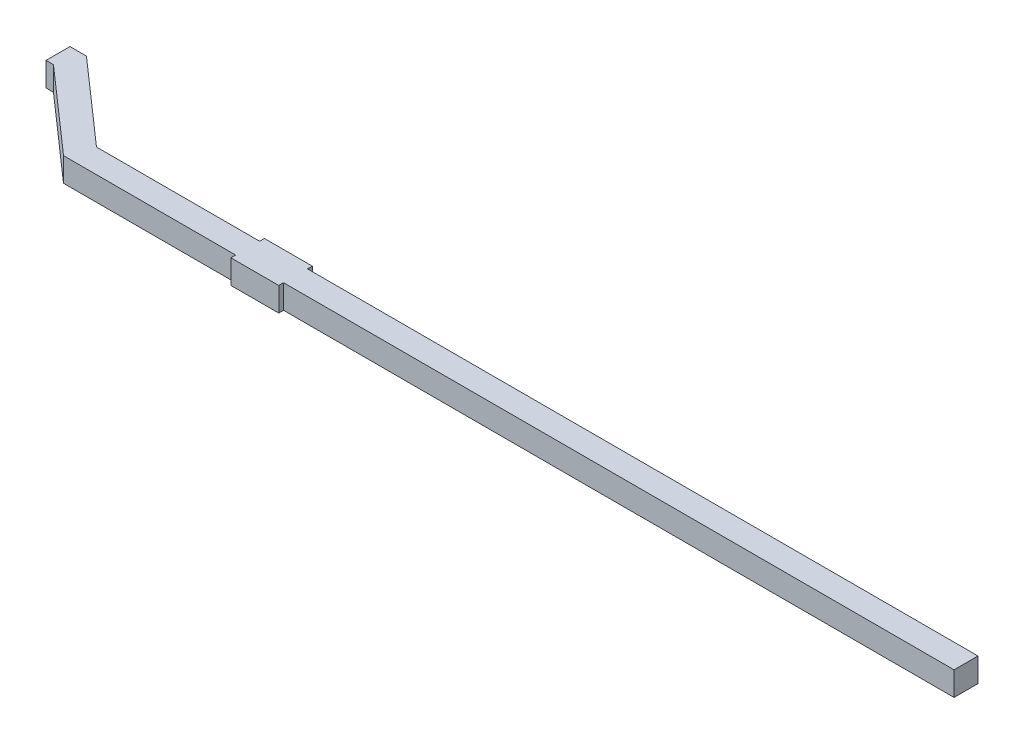
ISO-10303-21;
HEADER;
FILE_DESCRIPTION(('STEP AP214'),'2;1');
FILE_NAME('part.step','',(''),(''),'','','');
FILE_SCHEMA(('AUTOMOTIVE_DESIGN { 1 0 10303 214 1 1 1 1 }'));
ENDSEC;
DATA;
#1=APPLICATION_CONTEXT('core data for automotive mechanical design processes');
#2=APPLICATION_PROTOCOL_DEFINITION('international standard','automotive_design',2000,#1);
#3=PRODUCT_CONTEXT('',#1,'mechanical');
#4=PRODUCT('Part','Part','',(#3));
#5=PRODUCT_RELATED_PRODUCT_CATEGORY('part','',(#4));
#6=PRODUCT_DEFINITION_FORMATION('','',#4);
#7=PRODUCT_DEFINITION_CONTEXT('part definition',#1,'design');
#8=PRODUCT_DEFINITION('design','',#6,#7);
#9=PRODUCT_DEFINITION_SHAPE('','',#8);
#10=(LENGTH_UNIT() NAMED_UNIT(*) SI_UNIT(.MILLI.,.METRE.));
#11=(NAMED_UNIT(*) PLANE_ANGLE_UNIT() SI_UNIT($,.RADIAN.));
#12=(NAMED_UNIT(*) SI_UNIT($,.STERADIAN.) SOLID_ANGLE_UNIT());
#13=UNCERTAINTY_MEASURE_WITH_UNIT(LENGTH_MEASURE(1.E-05),#10,'distance_accuracy_value','');
#14=(GEOMETRIC_REPRESENTATION_CONTEXT(3) GLOBAL_UNCERTAINTY_ASSIGNED_CONTEXT((#13)) GLOBAL_UNIT_ASSIGNED_CONTEXT((#10,
#11,#12)) REPRESENTATION_CONTEXT('',''));
#15=CARTESIAN_POINT('',(0.,0.,0.));
#16=DIRECTION('',(0.,0.,1.));
#17=DIRECTION('',(1.,0.,0.));
#18=AXIS2_PLACEMENT_3D('',#15,#16,#17);
#19=CARTESIAN_POINT('',(0.,0.,0.));
#20=DIRECTION('',(0.,1.,0.));
#21=DIRECTION('',(1.,0.,0.));
#22=AXIS2_PLACEMENT_3D('',#19,#20,#21);
#23=PLANE('',#22);
#24=DIRECTION('',(0.,0.,-1.));
#25=VECTOR('',#24,1.);
#26=CARTESIAN_POINT('',(6.5,0.,2.14));
#27=LINE('',#26,#25);
#28=CARTESIAN_POINT('',(6.5,0.,2.14));
#29=VERTEX_POINT('',#28);
#30=CARTESIAN_POINT('',(6.5,0.,2.04));
#31=VERTEX_POINT('',#30);
#32=EDGE_CURVE('E125',#29,#31,#27,.T.);
#33=ORIENTED_EDGE('',*,*,#32,.F.);
#34=DIRECTION('',(1.,0.,0.));
#35=VECTOR('',#34,1.);
#36=CARTESIAN_POINT('',(5.5,0.,2.14));
#37=LINE('',#36,#35);
#38=CARTESIAN_POINT('',(5.5,0.,2.14));
#39=VERTEX_POINT('',#38);
#40=EDGE_CURVE('E191',#39,#29,#37,.T.);
#41=ORIENTED_EDGE('',*,*,#40,.F.);
#42=DIRECTION('',(0.,0.,1.));
#43=VECTOR('',#42,1.);
#44=CARTESIAN_POINT('',(5.5,0.,2.04));
#45=LINE('',#44,#43);
#46=CARTESIAN_POINT('',(5.5,0.,2.04));
#47=VERTEX_POINT('',#46);
#48=EDGE_CURVE('E258',#47,#39,#45,.T.);
#49=ORIENTED_EDGE('',*,*,#48,.F.);
#50=DIRECTION('',(1.,0.,0.));
#51=VECTOR('',#50,1.);
#52=CARTESIAN_POINT('',(1.905663049878,0.,2.04));
#53=LINE('',#52,#51);
#54=CARTESIAN_POINT('',(1.905663049878,0.,2.04));
#55=VERTEX_POINT('',#54);
#56=EDGE_CURVE('E267',#55,#47,#53,.T.);
#57=ORIENTED_EDGE('',*,*,#56,.F.);
#58=DIRECTION('',(0.750713516922874,0.,0.660627894891889));
#59=VECTOR('',#58,1.);
#60=CARTESIAN_POINT('',(0.155663049878,0.,0.5));
#61=LINE('',#60,#59);
#62=CARTESIAN_POINT('',(0.155663049878,0.,0.5));
#63=VERTEX_POINT('',#62);
#64=EDGE_CURVE('E266',#63,#55,#61,.T.);
#65=ORIENTED_EDGE('',*,*,#64,.F.);
#66=DIRECTION('',(1.,0.,0.));
#67=VECTOR('',#66,1.);
#68=CARTESIAN_POINT('',(0.,0.,0.5));
#69=LINE('',#68,#67);
#70=CARTESIAN_POINT('',(0.,0.,0.5));
#71=VERTEX_POINT('',#70);
#72=EDGE_CURVE('E248',#71,#63,#69,.T.);
#73=ORIENTED_EDGE('',*,*,#72,.F.);
#74=DIRECTION('',(0.,0.,1.));
#75=VECTOR('',#74,1.);
#76=CARTESIAN_POINT('',(0.,0.,0.));
#77=LINE('',#76,#75);
#78=CARTESIAN_POINT('',(0.,0.,0.));
#79=VERTEX_POINT('',#78);
#80=EDGE_CURVE('E171',#79,#71,#77,.T.);
#81=ORIENTED_EDGE('',*,*,#80,.F.);
#82=DIRECTION('',(-1.,0.,0.));
#83=VECTOR('',#82,1.);
#84=CARTESIAN_POINT('',(0.344336950122,0.,0.));
#85=LINE('',#84,#83);
#86=CARTESIAN_POINT('',(0.344336950122,0.,0.));
#87=VERTEX_POINT('',#86);
#88=EDGE_CURVE('E169',#87,#79,#85,.T.);
#89=ORIENTED_EDGE('',*,*,#88,.F.);
#90=DIRECTION('',(-0.750713516922874,0.,-0.660627894891889));
#91=VECTOR('',#90,1.);
#92=CARTESIAN_POINT('',(2.094336950122,0.,1.54));
#93=LINE('',#92,#91);
#94=CARTESIAN_POINT('',(2.094336950122,0.,1.54));
#95=VERTEX_POINT('',#94);
#96=EDGE_CURVE('E158',#95,#87,#93,.T.);
#97=ORIENTED_EDGE('',*,*,#96,.F.);
#98=DIRECTION('',(-1.,0.,0.));
#99=VECTOR('',#98,1.);
#100=CARTESIAN_POINT('',(5.5,0.,1.54));
#101=LINE('',#100,#99);
#102=CARTESIAN_POINT('',(5.5,0.,1.54));
#103=VERTEX_POINT('',#102);
#104=EDGE_CURVE('E208',#103,#95,#101,.T.);
#105=ORIENTED_EDGE('',*,*,#104,.F.);
#106=DIRECTION('',(0.,0.,1.));
#107=VECTOR('',#106,1.);
#108=CARTESIAN_POINT('',(5.5,0.,1.44));
#109=LINE('',#108,#107);
#110=CARTESIAN_POINT('',(5.5,0.,1.44));
#111=VERTEX_POINT('',#110);
#112=EDGE_CURVE('E212',#111,#103,#109,.T.);
#113=ORIENTED_EDGE('',*,*,#112,.F.);
#114=DIRECTION('',(-1.,0.,0.));
#115=VECTOR('',#114,1.);
#116=CARTESIAN_POINT('',(6.5,0.,1.44));
#117=LINE('',#116,#115);
#118=CARTESIAN_POINT('',(6.5,0.,1.44));
#119=VERTEX_POINT('',#118);
#120=EDGE_CURVE('E322',#119,#111,#117,.T.);
#121=ORIENTED_EDGE('',*,*,#120,.F.);
#122=DIRECTION('',(0.,0.,-1.));
#123=VECTOR('',#122,1.);
#124=CARTESIAN_POINT('',(6.5,0.,1.54));
#125=LINE('',#124,#123);
#126=CARTESIAN_POINT('',(6.5,0.,1.54));
#127=VERTEX_POINT('',#126);
#128=EDGE_CURVE('E201',#127,#119,#125,.T.);
#129=ORIENTED_EDGE('',*,*,#128,.F.);
#130=DIRECTION('',(-1.,0.,0.));
#131=VECTOR('',#130,1.);
#132=CARTESIAN_POINT('',(20.5,0.,1.54));
#133=LINE('',#132,#131);
#134=CARTESIAN_POINT('',(20.5,0.,1.54));
#135=VERTEX_POINT('',#134);
#136=EDGE_CURVE('E27',#135,#127,#133,.T.);
#137=ORIENTED_EDGE('',*,*,#136,.F.);
#138=DIRECTION('',(0.,0.,-1.));
#139=VECTOR('',#138,1.);
#140=CARTESIAN_POINT('',(20.5,0.,2.04));
#141=LINE('',#140,#139);
#142=CARTESIAN_POINT('',(20.5,0.,2.04));
#143=VERTEX_POINT('',#142);
#144=EDGE_CURVE('E11',#143,#135,#141,.T.);
#145=ORIENTED_EDGE('',*,*,#144,.F.);
#146=DIRECTION('',(1.,0.,0.));
#147=VECTOR('',#146,1.);
#148=CARTESIAN_POINT('',(6.5,0.,2.04));
#149=LINE('',#148,#147);
#150=EDGE_CURVE('E216',#31,#143,#149,.T.);
#151=ORIENTED_EDGE('',*,*,#150,.F.);
#152=EDGE_LOOP('',(#33,#41,#49,#57,#65,#73,#81,#89,#97,#105,#113,#121,#129,#137,#145,#151));
#153=FACE_BOUND('',#152,.T.);
#154=ADVANCED_FACE('F16',(#153),#23,.F.);
#155=CARTESIAN_POINT('',(20.5,0.,2.04));
#156=DIRECTION('',(1.,0.,0.));
#157=DIRECTION('',(0.,1.,0.));
#158=AXIS2_PLACEMENT_3D('',#155,#156,#157);
#159=PLANE('',#158);
#160=DIRECTION('',(0.,0.,-1.));
#161=VECTOR('',#160,1.);
#162=CARTESIAN_POINT('',(20.5,0.5,0.));
#163=LINE('',#162,#161);
#164=CARTESIAN_POINT('',(20.5,0.5,2.04));
#165=VERTEX_POINT('',#164);
#166=CARTESIAN_POINT('',(20.5,0.5,1.54));
#167=VERTEX_POINT('',#166);
#168=EDGE_CURVE('E202',#165,#167,#163,.T.);
#169=ORIENTED_EDGE('',*,*,#168,.F.);
#170=DIRECTION('',(0.,1.,0.));
#171=VECTOR('',#170,1.);
#172=CARTESIAN_POINT('',(20.5,0.,2.04));
#173=LINE('',#172,#171);
#174=EDGE_CURVE('E196',#143,#165,#173,.T.);
#175=ORIENTED_EDGE('',*,*,#174,.F.);
#176=ORIENTED_EDGE('',*,*,#144,.T.);
#177=DIRECTION('',(0.,-1.,0.));
#178=VECTOR('',#177,1.);
#179=CARTESIAN_POINT('',(20.5,0.,1.54));
#180=LINE('',#179,#178);
#181=EDGE_CURVE('E197',#167,#135,#180,.T.);
#182=ORIENTED_EDGE('',*,*,#181,.F.);
#183=EDGE_LOOP('',(#169,#175,#176,#182));
#184=FACE_BOUND('',#183,.T.);
#185=ADVANCED_FACE('F376',(#184),#159,.T.);
#186=CARTESIAN_POINT('',(20.5,0.,1.54));
#187=DIRECTION('',(0.,0.,-1.));
#188=DIRECTION('',(0.,-1.,0.));
#189=AXIS2_PLACEMENT_3D('',#186,#187,#188);
#190=PLANE('',#189);
#191=DIRECTION('',(-1.,0.,0.));
#192=VECTOR('',#191,1.);
#193=CARTESIAN_POINT('',(0.,0.5,1.54));
#194=LINE('',#193,#192);
#195=CARTESIAN_POINT('',(6.5,0.5,1.54));
#196=VERTEX_POINT('',#195);
#197=EDGE_CURVE('E206',#167,#196,#194,.T.);
#198=ORIENTED_EDGE('',*,*,#197,.F.);
#199=ORIENTED_EDGE('',*,*,#181,.T.);
#200=ORIENTED_EDGE('',*,*,#136,.T.);
#201=DIRECTION('',(0.,-1.,0.));
#202=VECTOR('',#201,1.);
#203=CARTESIAN_POINT('',(6.5,0.,1.54));
#204=LINE('',#203,#202);
#205=EDGE_CURVE('E318',#196,#127,#204,.T.);
#206=ORIENTED_EDGE('',*,*,#205,.F.);
#207=EDGE_LOOP('',(#198,#199,#200,#206));
#208=FACE_BOUND('',#207,.T.);
#209=ADVANCED_FACE('F379',(#208),#190,.T.);
#210=CARTESIAN_POINT('',(6.5,0.,1.54));
#211=DIRECTION('',(1.,0.,0.));
#212=DIRECTION('',(0.,1.,0.));
#213=AXIS2_PLACEMENT_3D('',#210,#211,#212);
#214=PLANE('',#213);
#215=DIRECTION('',(0.,0.,-1.));
#216=VECTOR('',#215,1.);
#217=CARTESIAN_POINT('',(6.5,0.5,0.));
#218=LINE('',#217,#216);
#219=CARTESIAN_POINT('',(6.5,0.5,1.44));
#220=VERTEX_POINT('',#219);
#221=EDGE_CURVE('E228',#196,#220,#218,.T.);
#222=ORIENTED_EDGE('',*,*,#221,.F.);
#223=ORIENTED_EDGE('',*,*,#205,.T.);
#224=ORIENTED_EDGE('',*,*,#128,.T.);
#225=DIRECTION('',(0.,-1.,0.));
#226=VECTOR('',#225,1.);
#227=CARTESIAN_POINT('',(6.5,0.,1.44));
#228=LINE('',#227,#226);
#229=EDGE_CURVE('E215',#220,#119,#228,.T.);
#230=ORIENTED_EDGE('',*,*,#229,.F.);
#231=EDGE_LOOP('',(#222,#223,#224,#230));
#232=FACE_BOUND('',#231,.T.);
#233=ADVANCED_FACE('F383',(#232),#214,.T.);
#234=CARTESIAN_POINT('',(6.5,0.,1.44));
#235=DIRECTION('',(0.,0.,-1.));
#236=DIRECTION('',(0.,-1.,0.));
#237=AXIS2_PLACEMENT_3D('',#234,#235,#236);
#238=PLANE('',#237);
#239=DIRECTION('',(-1.,0.,0.));
#240=VECTOR('',#239,1.);
#241=CARTESIAN_POINT('',(0.,0.5,1.44));
#242=LINE('',#241,#240);
#243=CARTESIAN_POINT('',(5.5,0.5,1.44));
#244=VERTEX_POINT('',#243);
#245=EDGE_CURVE('E232',#220,#244,#242,.T.);
#246=ORIENTED_EDGE('',*,*,#245,.F.);
#247=ORIENTED_EDGE('',*,*,#229,.T.);
#248=ORIENTED_EDGE('',*,*,#120,.T.);
#249=DIRECTION('',(0.,-1.,0.));
#250=VECTOR('',#249,1.);
#251=CARTESIAN_POINT('',(5.5,0.,1.44));
#252=LINE('',#251,#250);
#253=EDGE_CURVE('E211',#244,#111,#252,.T.);
#254=ORIENTED_EDGE('',*,*,#253,.F.);
#255=EDGE_LOOP('',(#246,#247,#248,#254));
#256=FACE_BOUND('',#255,.T.);
#257=ADVANCED_FACE('F389',(#256),#238,.T.);
#258=CARTESIAN_POINT('',(5.5,0.,1.44));
#259=DIRECTION('',(-1.,0.,0.));
#260=DIRECTION('',(0.,0.,1.));
#261=AXIS2_PLACEMENT_3D('',#258,#259,#260);
#262=PLANE('',#261);
#263=DIRECTION('',(0.,0.,1.));
#264=VECTOR('',#263,1.);
#265=CARTESIAN_POINT('',(5.5,0.5,0.));
#266=LINE('',#265,#264);
#267=CARTESIAN_POINT('',(5.5,0.5,1.54));
#268=VERTEX_POINT('',#267);
#269=EDGE_CURVE('E233',#244,#268,#266,.T.);
#270=ORIENTED_EDGE('',*,*,#269,.F.);
#271=ORIENTED_EDGE('',*,*,#253,.T.);
#272=ORIENTED_EDGE('',*,*,#112,.T.);
#273=DIRECTION('',(0.,-1.,0.));
#274=VECTOR('',#273,1.);
#275=CARTESIAN_POINT('',(5.5,0.,1.54));
#276=LINE('',#275,#274);
#277=EDGE_CURVE('E20',#268,#103,#276,.T.);
#278=ORIENTED_EDGE('',*,*,#277,.F.);
#279=EDGE_LOOP('',(#270,#271,#272,#278));
#280=FACE_BOUND('',#279,.T.);
#281=ADVANCED_FACE('F394',(#280),#262,.T.);
#282=CARTESIAN_POINT('',(5.5,0.,1.54));
#283=DIRECTION('',(0.,0.,-1.));
#284=DIRECTION('',(0.,-1.,0.));
#285=AXIS2_PLACEMENT_3D('',#282,#283,#284);
#286=PLANE('',#285);
#287=DIRECTION('',(-1.,0.,0.));
#288=VECTOR('',#287,1.);
#289=CARTESIAN_POINT('',(0.,0.5,1.54));
#290=LINE('',#289,#288);
#291=CARTESIAN_POINT('',(2.094336950122,0.5,1.54));
#292=VERTEX_POINT('',#291);
#293=EDGE_CURVE('E237',#268,#292,#290,.T.);
#294=ORIENTED_EDGE('',*,*,#293,.F.);
#295=ORIENTED_EDGE('',*,*,#277,.T.);
#296=ORIENTED_EDGE('',*,*,#104,.T.);
#297=DIRECTION('',(0.,-1.,0.));
#298=VECTOR('',#297,1.);
#299=CARTESIAN_POINT('',(2.094336950122,0.,1.54));
#300=LINE('',#299,#298);
#301=EDGE_CURVE('E165',#292,#95,#300,.T.);
#302=ORIENTED_EDGE('',*,*,#301,.F.);
#303=EDGE_LOOP('',(#294,#295,#296,#302));
#304=FACE_BOUND('',#303,.T.);
#305=ADVANCED_FACE('F439',(#304),#286,.T.);
#306=CARTESIAN_POINT('',(2.094336950122,0.,1.54));
#307=DIRECTION('',(0.660627894891889,0.,-0.750713516922874));
#308=DIRECTION('',(0.,-1.,0.));
#309=AXIS2_PLACEMENT_3D('',#306,#307,#308);
#310=PLANE('',#309);
#311=DIRECTION('',(-0.750713516922874,0.,-0.660627894891889));
#312=VECTOR('',#311,1.);
#313=CARTESIAN_POINT('',(2.094336950122,0.5,1.54));
#314=LINE('',#313,#312);
#315=CARTESIAN_POINT('',(0.344336950122,0.5,0.));
#316=VERTEX_POINT('',#315);
#317=EDGE_CURVE('E245',#292,#316,#314,.T.);
#318=ORIENTED_EDGE('',*,*,#317,.F.);
#319=ORIENTED_EDGE('',*,*,#301,.T.);
#320=ORIENTED_EDGE('',*,*,#96,.T.);
#321=DIRECTION('',(0.,-1.,0.));
#322=VECTOR('',#321,1.);
#323=CARTESIAN_POINT('',(0.344336950122,0.,0.));
#324=LINE('',#323,#322);
#325=EDGE_CURVE('E163',#316,#87,#324,.T.);
#326=ORIENTED_EDGE('',*,*,#325,.F.);
#327=EDGE_LOOP('',(#318,#319,#320,#326));
#328=FACE_BOUND('',#327,.T.);
#329=ADVANCED_FACE('F161',(#328),#310,.T.);
#330=CARTESIAN_POINT('',(0.344336950122,0.,0.));
#331=DIRECTION('',(0.,0.,-1.));
#332=DIRECTION('',(0.,-1.,0.));
#333=AXIS2_PLACEMENT_3D('',#330,#331,#332);
#334=PLANE('',#333);
#335=DIRECTION('',(-1.,0.,0.));
#336=VECTOR('',#335,1.);
#337=CARTESIAN_POINT('',(0.,0.5,0.));
#338=LINE('',#337,#336);
#339=CARTESIAN_POINT('',(0.,0.5,0.));
#340=VERTEX_POINT('',#339);
#341=EDGE_CURVE('E179',#316,#340,#338,.T.);
#342=ORIENTED_EDGE('',*,*,#341,.F.);
#343=ORIENTED_EDGE('',*,*,#325,.T.);
#344=ORIENTED_EDGE('',*,*,#88,.T.);
#345=DIRECTION('',(0.,-1.,0.));
#346=VECTOR('',#345,1.);
#347=CARTESIAN_POINT('',(0.,0.,0.));
#348=LINE('',#347,#346);
#349=EDGE_CURVE('E187',#340,#79,#348,.T.);
#350=ORIENTED_EDGE('',*,*,#349,.F.);
#351=EDGE_LOOP('',(#342,#343,#344,#350));
#352=FACE_BOUND('',#351,.T.);
#353=ADVANCED_FACE('F177',(#352),#334,.T.);
#354=CARTESIAN_POINT('',(0.,0.,0.));
#355=DIRECTION('',(-1.,0.,0.));
#356=DIRECTION('',(0.,0.,1.));
#357=AXIS2_PLACEMENT_3D('',#354,#355,#356);
#358=PLANE('',#357);
#359=DIRECTION('',(0.,0.,1.));
#360=VECTOR('',#359,1.);
#361=CARTESIAN_POINT('',(0.,0.5,0.));
#362=LINE('',#361,#360);
#363=CARTESIAN_POINT('',(0.,0.5,0.5));
#364=VERTEX_POINT('',#363);
#365=EDGE_CURVE('E244',#340,#364,#362,.T.);
#366=ORIENTED_EDGE('',*,*,#365,.F.);
#367=ORIENTED_EDGE('',*,*,#349,.T.);
#368=ORIENTED_EDGE('',*,*,#80,.T.);
#369=DIRECTION('',(0.,-1.,0.));
#370=VECTOR('',#369,1.);
#371=CARTESIAN_POINT('',(0.,0.,0.5));
#372=LINE('',#371,#370);
#373=EDGE_CURVE('E284',#364,#71,#372,.T.);
#374=ORIENTED_EDGE('',*,*,#373,.F.);
#375=EDGE_LOOP('',(#366,#367,#368,#374));
#376=FACE_BOUND('',#375,.T.);
#377=ADVANCED_FACE('F653',(#376),#358,.T.);
#378=CARTESIAN_POINT('',(0.,0.,0.5));
#379=DIRECTION('',(0.,0.,1.));
#380=DIRECTION('',(1.,0.,0.));
#381=AXIS2_PLACEMENT_3D('',#378,#379,#380);
#382=PLANE('',#381);
#383=DIRECTION('',(1.,0.,0.));
#384=VECTOR('',#383,1.);
#385=CARTESIAN_POINT('',(0.,0.5,0.5));
#386=LINE('',#385,#384);
#387=CARTESIAN_POINT('',(0.155663049878,0.5,0.5));
#388=VERTEX_POINT('',#387);
#389=EDGE_CURVE('E249',#364,#388,#386,.T.);
#390=ORIENTED_EDGE('',*,*,#389,.F.);
#391=ORIENTED_EDGE('',*,*,#373,.T.);
#392=ORIENTED_EDGE('',*,*,#72,.T.);
#393=DIRECTION('',(0.,-1.,0.));
#394=VECTOR('',#393,1.);
#395=CARTESIAN_POINT('',(0.155663049878,0.,0.5));
#396=LINE('',#395,#394);
#397=EDGE_CURVE('E262',#388,#63,#396,.T.);
#398=ORIENTED_EDGE('',*,*,#397,.F.);
#399=EDGE_LOOP('',(#390,#391,#392,#398));
#400=FACE_BOUND('',#399,.T.);
#401=ADVANCED_FACE('F643',(#400),#382,.T.);
#402=CARTESIAN_POINT('',(0.155663049878,0.,0.5));
#403=DIRECTION('',(-0.660627894891889,0.,0.750713516922874));
#404=DIRECTION('',(0.,1.,0.));
#405=AXIS2_PLACEMENT_3D('',#402,#403,#404);
#406=PLANE('',#405);
#407=DIRECTION('',(0.750713516922874,0.,0.660627894891889));
#408=VECTOR('',#407,1.);
#409=CARTESIAN_POINT('',(0.155663049878,0.5,0.5));
#410=LINE('',#409,#408);
#411=CARTESIAN_POINT('',(1.905663049878,0.5,2.04));
#412=VERTEX_POINT('',#411);
#413=EDGE_CURVE('E253',#388,#412,#410,.T.);
#414=ORIENTED_EDGE('',*,*,#413,.F.);
#415=ORIENTED_EDGE('',*,*,#397,.T.);
#416=ORIENTED_EDGE('',*,*,#64,.T.);
#417=DIRECTION('',(0.,-1.,0.));
#418=VECTOR('',#417,1.);
#419=CARTESIAN_POINT('',(1.905663049878,0.,2.04));
#420=LINE('',#419,#418);
#421=EDGE_CURVE('E317',#412,#55,#420,.T.);
#422=ORIENTED_EDGE('',*,*,#421,.F.);
#423=EDGE_LOOP('',(#414,#415,#416,#422));
#424=FACE_BOUND('',#423,.T.);
#425=ADVANCED_FACE('F355',(#424),#406,.T.);
#426=CARTESIAN_POINT('',(1.905663049878,0.,2.04));
#427=DIRECTION('',(0.,0.,1.));
#428=DIRECTION('',(1.,0.,0.));
#429=AXIS2_PLACEMENT_3D('',#426,#427,#428);
#430=PLANE('',#429);
#431=DIRECTION('',(1.,0.,0.));
#432=VECTOR('',#431,1.);
#433=CARTESIAN_POINT('',(0.,0.5,2.04));
#434=LINE('',#433,#432);
#435=CARTESIAN_POINT('',(5.5,0.5,2.04));
#436=VERTEX_POINT('',#435);
#437=EDGE_CURVE('E271',#412,#436,#434,.T.);
#438=ORIENTED_EDGE('',*,*,#437,.F.);
#439=ORIENTED_EDGE('',*,*,#421,.T.);
#440=ORIENTED_EDGE('',*,*,#56,.T.);
#441=DIRECTION('',(0.,-1.,0.));
#442=VECTOR('',#441,1.);
#443=CARTESIAN_POINT('',(5.5,0.,2.04));
#444=LINE('',#443,#442);
#445=EDGE_CURVE('E254',#436,#47,#444,.T.);
#446=ORIENTED_EDGE('',*,*,#445,.F.);
#447=EDGE_LOOP('',(#438,#439,#440,#446));
#448=FACE_BOUND('',#447,.T.);
#449=ADVANCED_FACE('F18',(#448),#430,.T.);
#450=CARTESIAN_POINT('',(5.5,0.,2.04));
#451=DIRECTION('',(-1.,0.,0.));
#452=DIRECTION('',(0.,0.,1.));
#453=AXIS2_PLACEMENT_3D('',#450,#451,#452);
#454=PLANE('',#453);
#455=DIRECTION('',(0.,0.,1.));
#456=VECTOR('',#455,1.);
#457=CARTESIAN_POINT('',(5.5,0.5,0.));
#458=LINE('',#457,#456);
#459=CARTESIAN_POINT('',(5.5,0.5,2.14));
#460=VERTEX_POINT('',#459);
#461=EDGE_CURVE('E275',#436,#460,#458,.T.);
#462=ORIENTED_EDGE('',*,*,#461,.F.);
#463=ORIENTED_EDGE('',*,*,#445,.T.);
#464=ORIENTED_EDGE('',*,*,#48,.T.);
#465=DIRECTION('',(0.,-1.,0.));
#466=VECTOR('',#465,1.);
#467=CARTESIAN_POINT('',(5.5,0.,2.14));
#468=LINE('',#467,#466);
#469=EDGE_CURVE('E227',#460,#39,#468,.T.);
#470=ORIENTED_EDGE('',*,*,#469,.F.);
#471=EDGE_LOOP('',(#462,#463,#464,#470));
#472=FACE_BOUND('',#471,.T.);
#473=ADVANCED_FACE('F614',(#472),#454,.T.);
#474=CARTESIAN_POINT('',(5.5,0.,2.14));
#475=DIRECTION('',(0.,0.,1.));
#476=DIRECTION('',(1.,0.,0.));
#477=AXIS2_PLACEMENT_3D('',#474,#475,#476);
#478=PLANE('',#477);
#479=DIRECTION('',(1.,0.,0.));
#480=VECTOR('',#479,1.);
#481=CARTESIAN_POINT('',(0.,0.5,2.14));
#482=LINE('',#481,#480);
#483=CARTESIAN_POINT('',(6.5,0.5,2.14));
#484=VERTEX_POINT('',#483);
#485=EDGE_CURVE('E224',#460,#484,#482,.T.);
#486=ORIENTED_EDGE('',*,*,#485,.F.);
#487=ORIENTED_EDGE('',*,*,#469,.T.);
#488=ORIENTED_EDGE('',*,*,#40,.T.);
#489=DIRECTION('',(0.,-1.,0.));
#490=VECTOR('',#489,1.);
#491=CARTESIAN_POINT('',(6.5,0.,2.14));
#492=LINE('',#491,#490);
#493=EDGE_CURVE('E193',#484,#29,#492,.T.);
#494=ORIENTED_EDGE('',*,*,#493,.F.);
#495=EDGE_LOOP('',(#486,#487,#488,#494));
#496=FACE_BOUND('',#495,.T.);
#497=ADVANCED_FACE('F369',(#496),#478,.T.);
#498=CARTESIAN_POINT('',(6.5,0.,2.14));
#499=DIRECTION('',(1.,0.,0.));
#500=DIRECTION('',(0.,1.,0.));
#501=AXIS2_PLACEMENT_3D('',#498,#499,#500);
#502=PLANE('',#501);
#503=DIRECTION('',(0.,0.,-1.));
#504=VECTOR('',#503,1.);
#505=CARTESIAN_POINT('',(6.5,0.5,0.));
#506=LINE('',#505,#504);
#507=CARTESIAN_POINT('',(6.5,0.5,2.04));
#508=VERTEX_POINT('',#507);
#509=EDGE_CURVE('E276',#484,#508,#506,.T.);
#510=ORIENTED_EDGE('',*,*,#509,.F.);
#511=ORIENTED_EDGE('',*,*,#493,.T.);
#512=ORIENTED_EDGE('',*,*,#32,.T.);
#513=DIRECTION('',(0.,-1.,0.));
#514=VECTOR('',#513,1.);
#515=CARTESIAN_POINT('',(6.5,0.,2.04));
#516=LINE('',#515,#514);
#517=EDGE_CURVE('E220',#508,#31,#516,.T.);
#518=ORIENTED_EDGE('',*,*,#517,.F.);
#519=EDGE_LOOP('',(#510,#511,#512,#518));
#520=FACE_BOUND('',#519,.T.);
#521=ADVANCED_FACE('F371',(#520),#502,.T.);
#522=CARTESIAN_POINT('',(6.5,0.,2.04));
#523=DIRECTION('',(0.,0.,1.));
#524=DIRECTION('',(1.,0.,0.));
#525=AXIS2_PLACEMENT_3D('',#522,#523,#524);
#526=PLANE('',#525);
#527=DIRECTION('',(1.,0.,0.));
#528=VECTOR('',#527,1.);
#529=CARTESIAN_POINT('',(0.,0.5,2.04));
#530=LINE('',#529,#528);
#531=EDGE_CURVE('E207',#508,#165,#530,.T.);
#532=ORIENTED_EDGE('',*,*,#531,.F.);
#533=ORIENTED_EDGE('',*,*,#517,.T.);
#534=ORIENTED_EDGE('',*,*,#150,.T.);
#535=ORIENTED_EDGE('',*,*,#174,.T.);
#536=EDGE_LOOP('',(#532,#533,#534,#535));
#537=FACE_BOUND('',#536,.T.);
#538=ADVANCED_FACE('F375',(#537),#526,.T.);
#539=CARTESIAN_POINT('',(0.,0.5,0.));
#540=DIRECTION('',(0.,1.,0.));
#541=DIRECTION('',(1.,0.,0.));
#542=AXIS2_PLACEMENT_3D('',#539,#540,#541);
#543=PLANE('',#542);
#544=ORIENTED_EDGE('',*,*,#509,.T.);
#545=ORIENTED_EDGE('',*,*,#531,.T.);
#546=ORIENTED_EDGE('',*,*,#168,.T.);
#547=ORIENTED_EDGE('',*,*,#197,.T.);
#548=ORIENTED_EDGE('',*,*,#221,.T.);
#549=ORIENTED_EDGE('',*,*,#245,.T.);
#550=ORIENTED_EDGE('',*,*,#269,.T.);
#551=ORIENTED_EDGE('',*,*,#293,.T.);
#552=ORIENTED_EDGE('',*,*,#317,.T.);
#553=ORIENTED_EDGE('',*,*,#341,.T.);
#554=ORIENTED_EDGE('',*,*,#365,.T.);
#555=ORIENTED_EDGE('',*,*,#389,.T.);
#556=ORIENTED_EDGE('',*,*,#413,.T.);
#557=ORIENTED_EDGE('',*,*,#437,.T.);
#558=ORIENTED_EDGE('',*,*,#461,.T.);
#559=ORIENTED_EDGE('',*,*,#485,.T.);
#560=EDGE_LOOP('',(#544,#545,#546,#547,#548,#549,#550,#551,#552,#553,#554,#555,#556,#557,#558,#559));
#561=FACE_BOUND('',#560,.T.);
#562=ADVANCED_FACE('F352',(#561),#543,.T.);
#563=CLOSED_SHELL('',(#154,#185,#209,#233,#257,#281,#305,#329,#353,#377,#401,#425,#449,#473,
#497,#521,#538,#562));
#564=MANIFOLD_SOLID_BREP('B1',#563);
#565=ADVANCED_BREP_SHAPE_REPRESENTATION('',(#18,#564),#14);
#566=SHAPE_DEFINITION_REPRESENTATION(#9,#565);
ENDSEC;
END-ISO-10303-21;
